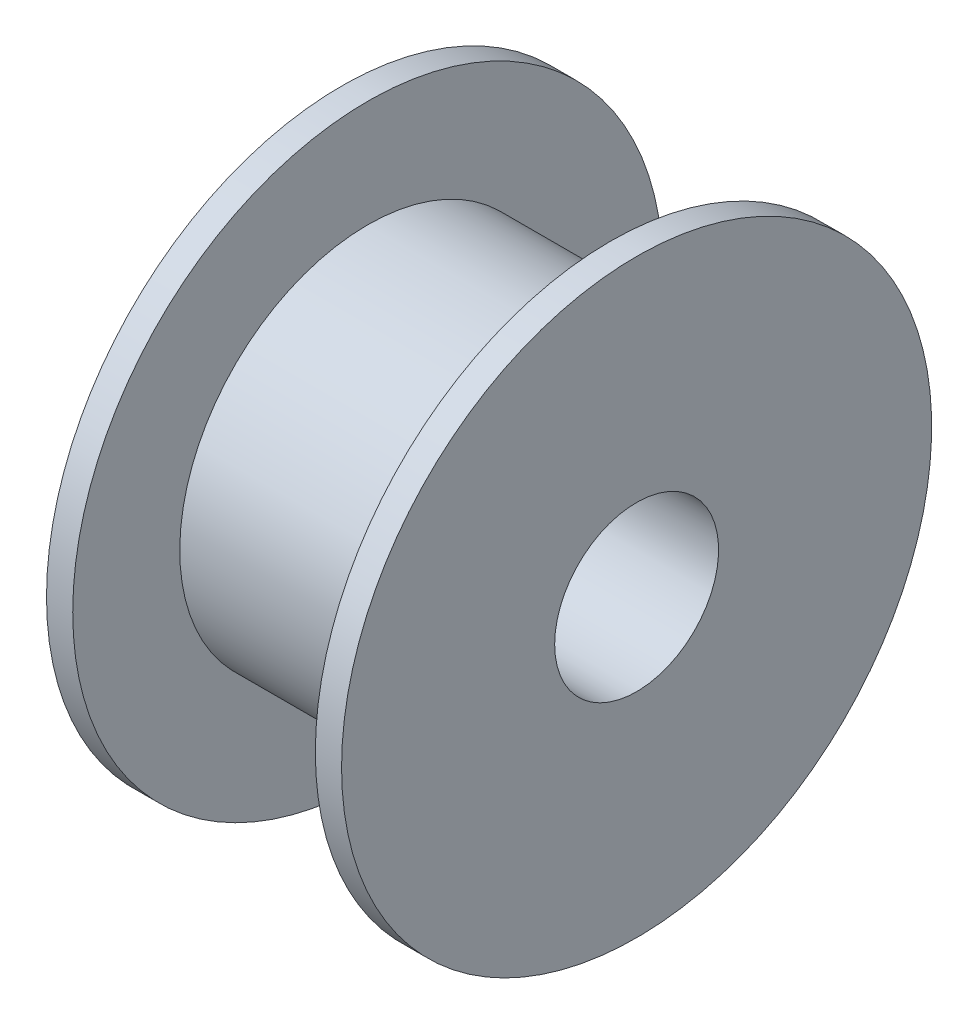
ISO-10303-21;
HEADER;
FILE_DESCRIPTION(('STEP AP214'),'2;1');
FILE_NAME('part.step','',(''),(''),'','','');
FILE_SCHEMA(('AUTOMOTIVE_DESIGN { 1 0 10303 214 1 1 1 1 }'));
ENDSEC;
DATA;
#1=APPLICATION_CONTEXT('core data for automotive mechanical design processes');
#2=APPLICATION_PROTOCOL_DEFINITION('international standard','automotive_design',2000,#1);
#3=PRODUCT_CONTEXT('',#1,'mechanical');
#4=PRODUCT('Part','Part','',(#3));
#5=PRODUCT_RELATED_PRODUCT_CATEGORY('part','',(#4));
#6=PRODUCT_DEFINITION_FORMATION('','',#4);
#7=PRODUCT_DEFINITION_CONTEXT('part definition',#1,'design');
#8=PRODUCT_DEFINITION('design','',#6,#7);
#9=PRODUCT_DEFINITION_SHAPE('','',#8);
#10=(LENGTH_UNIT() NAMED_UNIT(*) SI_UNIT(.MILLI.,.METRE.));
#11=(NAMED_UNIT(*) PLANE_ANGLE_UNIT() SI_UNIT($,.RADIAN.));
#12=(NAMED_UNIT(*) SI_UNIT($,.STERADIAN.) SOLID_ANGLE_UNIT());
#13=UNCERTAINTY_MEASURE_WITH_UNIT(LENGTH_MEASURE(1.E-05),#10,'distance_accuracy_value','');
#14=(GEOMETRIC_REPRESENTATION_CONTEXT(3) GLOBAL_UNCERTAINTY_ASSIGNED_CONTEXT((#13)) GLOBAL_UNIT_ASSIGNED_CONTEXT((#10,
#11,#12)) REPRESENTATION_CONTEXT('',''));
#15=CARTESIAN_POINT('',(0.,0.,0.));
#16=DIRECTION('',(0.,0.,1.));
#17=DIRECTION('',(1.,0.,0.));
#18=AXIS2_PLACEMENT_3D('',#15,#16,#17);
#19=CARTESIAN_POINT('',(0.8,0.,0.));
#20=DIRECTION('',(1.,0.,0.));
#21=DIRECTION('',(0.,0.,1.));
#22=AXIS2_PLACEMENT_3D('',#19,#20,#21);
#23=CYLINDRICAL_SURFACE('',#22,5.735);
#24=CARTESIAN_POINT('',(8.2,0.,0.));
#25=DIRECTION('',(1.,0.,0.));
#26=DIRECTION('',(0.,0.,1.));
#27=AXIS2_PLACEMENT_3D('',#24,#25,#26);
#28=CIRCLE('',#27,5.735);
#29=CARTESIAN_POINT('',(8.2,2.92718188954023,4.93171685983164));
#30=VERTEX_POINT('',#29);
#31=EDGE_CURVE('E34',#30,#30,#28,.T.);
#32=ORIENTED_EDGE('',*,*,#31,.F.);
#33=EDGE_LOOP('',(#32));
#34=FACE_BOUND('',#33,.T.);
#35=CARTESIAN_POINT('',(0.8,0.,0.));
#36=DIRECTION('',(1.,0.,0.));
#37=DIRECTION('',(0.,0.,1.));
#38=AXIS2_PLACEMENT_3D('',#35,#36,#37);
#39=CIRCLE('',#38,5.735);
#40=CARTESIAN_POINT('',(0.8,2.92718188954023,4.93171685983164));
#41=VERTEX_POINT('',#40);
#42=EDGE_CURVE('E11',#41,#41,#39,.T.);
#43=ORIENTED_EDGE('',*,*,#42,.T.);
#44=EDGE_LOOP('',(#43));
#45=FACE_BOUND('',#44,.T.);
#46=ADVANCED_FACE('F17',(#34,#45),#23,.T.);
#47=CARTESIAN_POINT('',(8.2,0.,0.));
#48=DIRECTION('',(-1.,0.,0.));
#49=DIRECTION('',(0.,0.707106781186548,0.707106781186548));
#50=AXIS2_PLACEMENT_3D('',#47,#48,#49);
#51=PLANE('',#50);
#52=CARTESIAN_POINT('',(8.2,0.,0.));
#53=DIRECTION('',(-1.,0.,0.));
#54=DIRECTION('',(0.,0.,1.));
#55=AXIS2_PLACEMENT_3D('',#52,#53,#54);
#56=CIRCLE('',#55,9.);
#57=CARTESIAN_POINT('',(8.2,0.,-9.));
#58=VERTEX_POINT('',#57);
#59=EDGE_CURVE('E27',#58,#58,#56,.T.);
#60=ORIENTED_EDGE('',*,*,#59,.T.);
#61=EDGE_LOOP('',(#60));
#62=FACE_BOUND('',#61,.T.);
#63=ORIENTED_EDGE('',*,*,#31,.T.);
#64=EDGE_LOOP('',(#63));
#65=FACE_BOUND('',#64,.T.);
#66=ADVANCED_FACE('F73',(#62,#65),#51,.T.);
#67=CARTESIAN_POINT('',(0.8,0.,0.));
#68=DIRECTION('',(1.,0.,0.));
#69=DIRECTION('',(0.,0.707106781186548,0.707106781186548));
#70=AXIS2_PLACEMENT_3D('',#67,#68,#69);
#71=PLANE('',#70);
#72=ORIENTED_EDGE('',*,*,#42,.F.);
#73=EDGE_LOOP('',(#72));
#74=FACE_BOUND('',#73,.T.);
#75=CARTESIAN_POINT('',(0.8,0.,0.));
#76=DIRECTION('',(-1.,0.,0.));
#77=DIRECTION('',(0.,0.,1.));
#78=AXIS2_PLACEMENT_3D('',#75,#76,#77);
#79=CIRCLE('',#78,9.);
#80=CARTESIAN_POINT('',(0.8,0.,9.));
#81=VERTEX_POINT('',#80);
#82=EDGE_CURVE('E61',#81,#81,#79,.T.);
#83=ORIENTED_EDGE('',*,*,#82,.F.);
#84=EDGE_LOOP('',(#83));
#85=FACE_BOUND('',#84,.T.);
#86=ADVANCED_FACE('F75',(#74,#85),#71,.T.);
#87=CARTESIAN_POINT('',(0.,0.,0.));
#88=DIRECTION('',(-1.,0.,0.));
#89=DIRECTION('',(0.,0.,1.));
#90=AXIS2_PLACEMENT_3D('',#87,#88,#89);
#91=CYLINDRICAL_SURFACE('',#90,9.);
#92=ORIENTED_EDGE('',*,*,#82,.T.);
#93=EDGE_LOOP('',(#92));
#94=FACE_BOUND('',#93,.T.);
#95=CARTESIAN_POINT('',(0.,0.,0.));
#96=DIRECTION('',(-1.,0.,0.));
#97=DIRECTION('',(0.,0.,1.));
#98=AXIS2_PLACEMENT_3D('',#95,#96,#97);
#99=CIRCLE('',#98,9.);
#100=CARTESIAN_POINT('',(0.,0.,9.));
#101=VERTEX_POINT('',#100);
#102=EDGE_CURVE('E59',#101,#101,#99,.T.);
#103=ORIENTED_EDGE('',*,*,#102,.F.);
#104=EDGE_LOOP('',(#103));
#105=FACE_BOUND('',#104,.T.);
#106=ADVANCED_FACE('F83',(#94,#105),#91,.T.);
#107=CARTESIAN_POINT('',(0.,0.,0.));
#108=DIRECTION('',(-1.,0.,0.));
#109=DIRECTION('',(0.,0.707106781186548,0.707106781186548));
#110=AXIS2_PLACEMENT_3D('',#107,#108,#109);
#111=PLANE('',#110);
#112=ORIENTED_EDGE('',*,*,#102,.T.);
#113=EDGE_LOOP('',(#112));
#114=FACE_BOUND('',#113,.T.);
#115=CARTESIAN_POINT('',(0.,0.,0.));
#116=DIRECTION('',(-1.,0.,0.));
#117=DIRECTION('',(0.,0.,1.));
#118=AXIS2_PLACEMENT_3D('',#115,#116,#117);
#119=CIRCLE('',#118,2.5);
#120=CARTESIAN_POINT('',(0.,0.,2.5));
#121=VERTEX_POINT('',#120);
#122=EDGE_CURVE('E63',#121,#121,#119,.T.);
#123=ORIENTED_EDGE('',*,*,#122,.F.);
#124=EDGE_LOOP('',(#123));
#125=FACE_BOUND('',#124,.T.);
#126=ADVANCED_FACE('F90',(#114,#125),#111,.T.);
#127=CARTESIAN_POINT('',(9.,0.,0.));
#128=DIRECTION('',(-1.,0.,0.));
#129=DIRECTION('',(0.,0.707106781186548,0.707106781186548));
#130=AXIS2_PLACEMENT_3D('',#127,#128,#129);
#131=PLANE('',#130);
#132=CARTESIAN_POINT('',(9.,0.,0.));
#133=DIRECTION('',(-1.,0.,0.));
#134=DIRECTION('',(0.,0.,1.));
#135=AXIS2_PLACEMENT_3D('',#132,#133,#134);
#136=CIRCLE('',#135,9.);
#137=CARTESIAN_POINT('',(9.,0.,9.));
#138=VERTEX_POINT('',#137);
#139=EDGE_CURVE('E53',#138,#138,#136,.T.);
#140=ORIENTED_EDGE('',*,*,#139,.F.);
#141=EDGE_LOOP('',(#140));
#142=FACE_BOUND('',#141,.T.);
#143=CARTESIAN_POINT('',(9.,0.,0.));
#144=DIRECTION('',(-1.,0.,0.));
#145=DIRECTION('',(0.,0.,1.));
#146=AXIS2_PLACEMENT_3D('',#143,#144,#145);
#147=CIRCLE('',#146,2.5);
#148=CARTESIAN_POINT('',(9.,0.,2.5));
#149=VERTEX_POINT('',#148);
#150=EDGE_CURVE('E21',#149,#149,#147,.T.);
#151=ORIENTED_EDGE('',*,*,#150,.T.);
#152=EDGE_LOOP('',(#151));
#153=FACE_BOUND('',#152,.T.);
#154=ADVANCED_FACE('F94',(#142,#153),#131,.F.);
#155=CARTESIAN_POINT('',(0.,0.,0.));
#156=DIRECTION('',(-1.,0.,0.));
#157=DIRECTION('',(0.,0.,1.));
#158=AXIS2_PLACEMENT_3D('',#155,#156,#157);
#159=CYLINDRICAL_SURFACE('',#158,9.);
#160=ORIENTED_EDGE('',*,*,#139,.T.);
#161=EDGE_LOOP('',(#160));
#162=FACE_BOUND('',#161,.T.);
#163=ORIENTED_EDGE('',*,*,#59,.F.);
#164=EDGE_LOOP('',(#163));
#165=FACE_BOUND('',#164,.T.);
#166=ADVANCED_FACE('F97',(#162,#165),#159,.T.);
#167=CARTESIAN_POINT('',(9.,0.,0.));
#168=DIRECTION('',(-1.,0.,0.));
#169=DIRECTION('',(0.,0.,1.));
#170=AXIS2_PLACEMENT_3D('',#167,#168,#169);
#171=CYLINDRICAL_SURFACE('',#170,2.5);
#172=ORIENTED_EDGE('',*,*,#150,.F.);
#173=EDGE_LOOP('',(#172));
#174=FACE_BOUND('',#173,.T.);
#175=ORIENTED_EDGE('',*,*,#122,.T.);
#176=EDGE_LOOP('',(#175));
#177=FACE_BOUND('',#176,.T.);
#178=ADVANCED_FACE('F19',(#174,#177),#171,.F.);
#179=CLOSED_SHELL('',(#46,#66,#86,#106,#126,#154,#166,#178));
#180=MANIFOLD_SOLID_BREP('B1',#179);
#181=ADVANCED_BREP_SHAPE_REPRESENTATION('',(#18,#180),#14);
#182=SHAPE_DEFINITION_REPRESENTATION(#9,#181);
ENDSEC;
END-ISO-10303-21;
